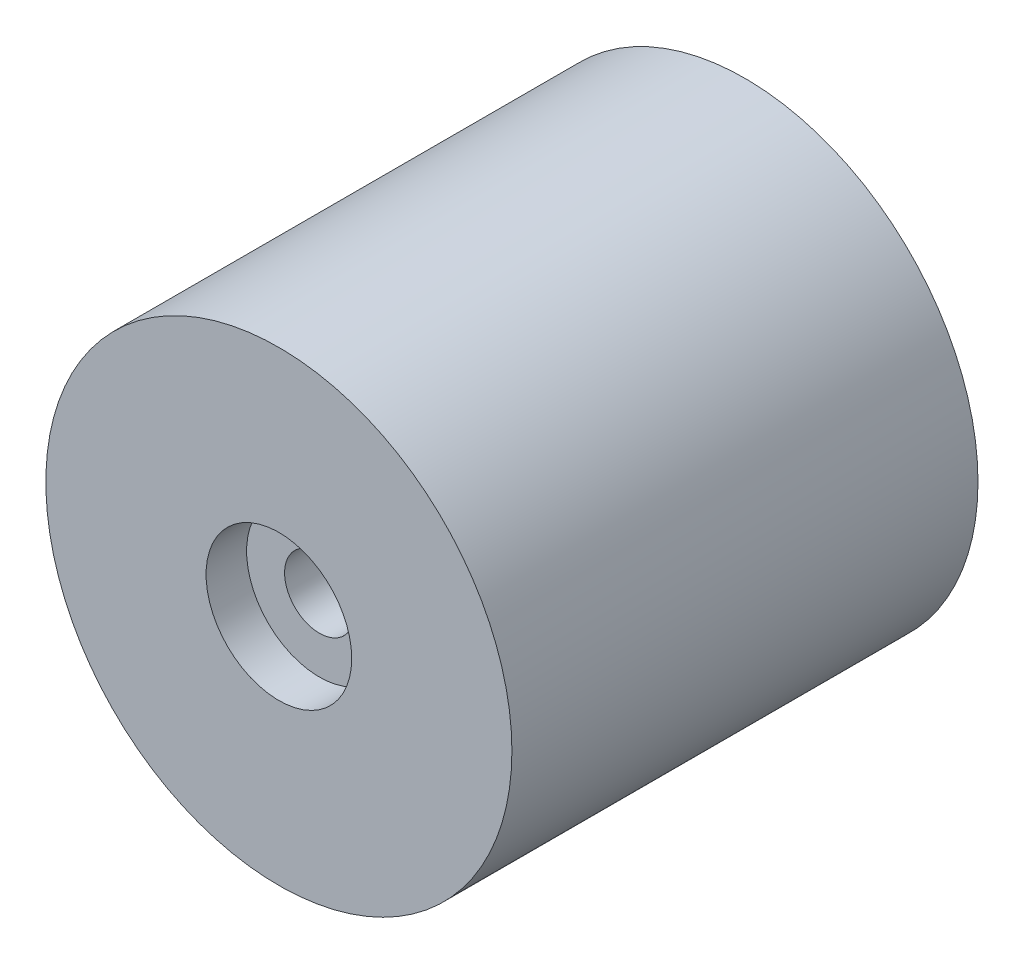
ISO-10303-21;
HEADER;
FILE_DESCRIPTION(('STEP AP214'),'2;1');
FILE_NAME('part.step','',(''),(''),'','','');
FILE_SCHEMA(('AUTOMOTIVE_DESIGN { 1 0 10303 214 1 1 1 1 }'));
ENDSEC;
DATA;
#1=APPLICATION_CONTEXT('core data for automotive mechanical design processes');
#2=APPLICATION_PROTOCOL_DEFINITION('international standard','automotive_design',2000,#1);
#3=PRODUCT_CONTEXT('',#1,'mechanical');
#4=PRODUCT('Part','Part','',(#3));
#5=PRODUCT_RELATED_PRODUCT_CATEGORY('part','',(#4));
#6=PRODUCT_DEFINITION_FORMATION('','',#4);
#7=PRODUCT_DEFINITION_CONTEXT('part definition',#1,'design');
#8=PRODUCT_DEFINITION('design','',#6,#7);
#9=PRODUCT_DEFINITION_SHAPE('','',#8);
#10=(LENGTH_UNIT() NAMED_UNIT(*) SI_UNIT(.MILLI.,.METRE.));
#11=(NAMED_UNIT(*) PLANE_ANGLE_UNIT() SI_UNIT($,.RADIAN.));
#12=(NAMED_UNIT(*) SI_UNIT($,.STERADIAN.) SOLID_ANGLE_UNIT());
#13=UNCERTAINTY_MEASURE_WITH_UNIT(LENGTH_MEASURE(1.E-05),#10,'distance_accuracy_value','');
#14=(GEOMETRIC_REPRESENTATION_CONTEXT(3) GLOBAL_UNCERTAINTY_ASSIGNED_CONTEXT((#13)) GLOBAL_UNIT_ASSIGNED_CONTEXT((#10,
#11,#12)) REPRESENTATION_CONTEXT('',''));
#15=CARTESIAN_POINT('',(0.,0.,0.));
#16=DIRECTION('',(0.,0.,1.));
#17=DIRECTION('',(1.,0.,0.));
#18=AXIS2_PLACEMENT_3D('',#15,#16,#17);
#19=CARTESIAN_POINT('',(0.,0.,-25.4));
#20=DIRECTION('',(0.,0.,1.));
#21=DIRECTION('',(1.,0.,0.));
#22=AXIS2_PLACEMENT_3D('',#19,#20,#21);
#23=CYLINDRICAL_SURFACE('',#22,12.7);
#24=CARTESIAN_POINT('',(0.,0.,-25.4));
#25=DIRECTION('',(0.,0.,1.));
#26=DIRECTION('',(1.,0.,0.));
#27=AXIS2_PLACEMENT_3D('',#24,#25,#26);
#28=CIRCLE('',#27,12.7);
#29=CARTESIAN_POINT('',(12.7,0.,-25.4));
#30=VERTEX_POINT('',#29);
#31=EDGE_CURVE('E10',#30,#30,#28,.T.);
#32=ORIENTED_EDGE('',*,*,#31,.T.);
#33=EDGE_LOOP('',(#32));
#34=FACE_BOUND('',#33,.T.);
#35=CARTESIAN_POINT('',(0.,0.,0.));
#36=DIRECTION('',(0.,0.,1.));
#37=DIRECTION('',(1.,0.,0.));
#38=AXIS2_PLACEMENT_3D('',#35,#36,#37);
#39=CIRCLE('',#38,12.7);
#40=CARTESIAN_POINT('',(12.7,0.,0.));
#41=VERTEX_POINT('',#40);
#42=EDGE_CURVE('E38',#41,#41,#39,.T.);
#43=ORIENTED_EDGE('',*,*,#42,.F.);
#44=EDGE_LOOP('',(#43));
#45=FACE_BOUND('',#44,.T.);
#46=ADVANCED_FACE('F35',(#34,#45),#23,.T.);
#47=CARTESIAN_POINT('',(0.,0.,-25.4));
#48=DIRECTION('',(0.,0.,1.));
#49=DIRECTION('',(1.,0.,0.));
#50=AXIS2_PLACEMENT_3D('',#47,#48,#49);
#51=PLANE('',#50);
#52=CARTESIAN_POINT('',(0.,0.,-25.4));
#53=DIRECTION('',(0.,0.,1.));
#54=DIRECTION('',(1.,0.,0.));
#55=AXIS2_PLACEMENT_3D('',#52,#53,#54);
#56=CIRCLE('',#55,1.89864999999999);
#57=CARTESIAN_POINT('',(1.89864999999999,0.,-25.4));
#58=VERTEX_POINT('',#57);
#59=EDGE_CURVE('E45',#58,#58,#56,.T.);
#60=ORIENTED_EDGE('',*,*,#59,.T.);
#61=EDGE_LOOP('',(#60));
#62=FACE_BOUND('',#61,.T.);
#63=ORIENTED_EDGE('',*,*,#31,.F.);
#64=EDGE_LOOP('',(#63));
#65=FACE_BOUND('',#64,.T.);
#66=ADVANCED_FACE('F65',(#62,#65),#51,.F.);
#67=CARTESIAN_POINT('',(0.,0.,0.));
#68=DIRECTION('',(0.,0.,1.));
#69=DIRECTION('',(1.,0.,0.));
#70=AXIS2_PLACEMENT_3D('',#67,#68,#69);
#71=PLANE('',#70);
#72=CARTESIAN_POINT('',(0.,0.,0.));
#73=DIRECTION('',(0.,0.,1.));
#74=DIRECTION('',(1.,0.,0.));
#75=AXIS2_PLACEMENT_3D('',#72,#73,#74);
#76=CIRCLE('',#75,3.96875);
#77=CARTESIAN_POINT('',(3.96875,0.,0.));
#78=VERTEX_POINT('',#77);
#79=EDGE_CURVE('E55',#78,#78,#76,.T.);
#80=ORIENTED_EDGE('',*,*,#79,.F.);
#81=EDGE_LOOP('',(#80));
#82=FACE_BOUND('',#81,.T.);
#83=ORIENTED_EDGE('',*,*,#42,.T.);
#84=EDGE_LOOP('',(#83));
#85=FACE_BOUND('',#84,.T.);
#86=ADVANCED_FACE('F61',(#82,#85),#71,.T.);
#87=CARTESIAN_POINT('',(0.,0.,0.));
#88=DIRECTION('',(0.,0.,1.));
#89=DIRECTION('',(1.,0.,0.));
#90=AXIS2_PLACEMENT_3D('',#87,#88,#89);
#91=CYLINDRICAL_SURFACE('',#90,1.89865);
#92=ORIENTED_EDGE('',*,*,#59,.F.);
#93=EDGE_LOOP('',(#92));
#94=FACE_BOUND('',#93,.T.);
#95=CARTESIAN_POINT('',(0.,0.,-2.2098));
#96=DIRECTION('',(0.,0.,1.));
#97=DIRECTION('',(1.,0.,0.));
#98=AXIS2_PLACEMENT_3D('',#95,#96,#97);
#99=CIRCLE('',#98,1.89865);
#100=CARTESIAN_POINT('',(1.89865,0.,-2.2098));
#101=VERTEX_POINT('',#100);
#102=EDGE_CURVE('E49',#101,#101,#99,.T.);
#103=ORIENTED_EDGE('',*,*,#102,.T.);
#104=EDGE_LOOP('',(#103));
#105=FACE_BOUND('',#104,.T.);
#106=ADVANCED_FACE('F64',(#94,#105),#91,.F.);
#107=CARTESIAN_POINT('',(1.89865,0.,-2.2098));
#108=DIRECTION('',(0.,0.,-1.));
#109=DIRECTION('',(-1.,0.,0.));
#110=AXIS2_PLACEMENT_3D('',#107,#108,#109);
#111=PLANE('',#110);
#112=ORIENTED_EDGE('',*,*,#102,.F.);
#113=EDGE_LOOP('',(#112));
#114=FACE_BOUND('',#113,.T.);
#115=CARTESIAN_POINT('',(0.,0.,-2.2098));
#116=DIRECTION('',(0.,0.,1.));
#117=DIRECTION('',(1.,0.,0.));
#118=AXIS2_PLACEMENT_3D('',#115,#116,#117);
#119=CIRCLE('',#118,3.96875);
#120=CARTESIAN_POINT('',(3.96875,0.,-2.2098));
#121=VERTEX_POINT('',#120);
#122=EDGE_CURVE('E52',#121,#121,#119,.T.);
#123=ORIENTED_EDGE('',*,*,#122,.T.);
#124=EDGE_LOOP('',(#123));
#125=FACE_BOUND('',#124,.T.);
#126=ADVANCED_FACE('F80',(#114,#125),#111,.F.);
#127=CARTESIAN_POINT('',(0.,0.,0.));
#128=DIRECTION('',(0.,0.,1.));
#129=DIRECTION('',(1.,0.,0.));
#130=AXIS2_PLACEMENT_3D('',#127,#128,#129);
#131=CYLINDRICAL_SURFACE('',#130,3.96875);
#132=ORIENTED_EDGE('',*,*,#122,.F.);
#133=EDGE_LOOP('',(#132));
#134=FACE_BOUND('',#133,.T.);
#135=ORIENTED_EDGE('',*,*,#79,.T.);
#136=EDGE_LOOP('',(#135));
#137=FACE_BOUND('',#136,.T.);
#138=ADVANCED_FACE('F59',(#134,#137),#131,.F.);
#139=CLOSED_SHELL('',(#46,#66,#86,#106,#126,#138));
#140=MANIFOLD_SOLID_BREP('B2',#139);
#141=ADVANCED_BREP_SHAPE_REPRESENTATION('',(#18,#140),#14);
#142=SHAPE_DEFINITION_REPRESENTATION(#9,#141);
ENDSEC;
END-ISO-10303-21;
